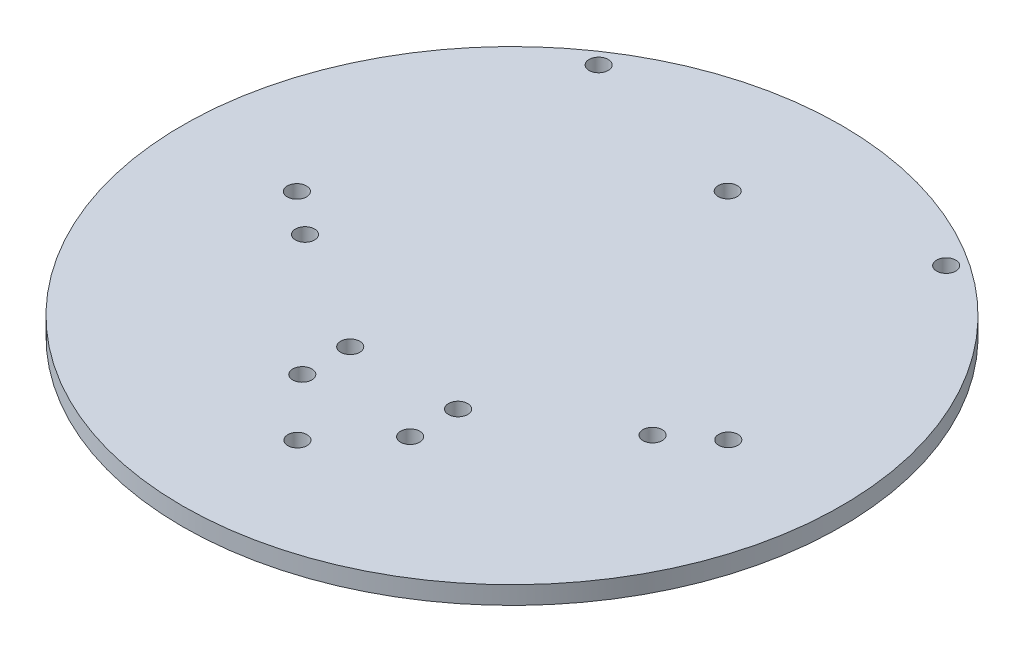
ISO-10303-21;
HEADER;
FILE_DESCRIPTION(('STEP AP214'),'2;1');
FILE_NAME('part.step','',(''),(''),'','','');
FILE_SCHEMA(('AUTOMOTIVE_DESIGN { 1 0 10303 214 1 1 1 1 }'));
ENDSEC;
DATA;
#1=APPLICATION_CONTEXT('core data for automotive mechanical design processes');
#2=APPLICATION_PROTOCOL_DEFINITION('international standard','automotive_design',2000,#1);
#3=PRODUCT_CONTEXT('',#1,'mechanical');
#4=PRODUCT('Part','Part','',(#3));
#5=PRODUCT_RELATED_PRODUCT_CATEGORY('part','',(#4));
#6=PRODUCT_DEFINITION_FORMATION('','',#4);
#7=PRODUCT_DEFINITION_CONTEXT('part definition',#1,'design');
#8=PRODUCT_DEFINITION('design','',#6,#7);
#9=PRODUCT_DEFINITION_SHAPE('','',#8);
#10=(LENGTH_UNIT() NAMED_UNIT(*) SI_UNIT(.MILLI.,.METRE.));
#11=(NAMED_UNIT(*) PLANE_ANGLE_UNIT() SI_UNIT($,.RADIAN.));
#12=(NAMED_UNIT(*) SI_UNIT($,.STERADIAN.) SOLID_ANGLE_UNIT());
#13=UNCERTAINTY_MEASURE_WITH_UNIT(LENGTH_MEASURE(1.E-05),#10,'distance_accuracy_value','');
#14=(GEOMETRIC_REPRESENTATION_CONTEXT(3) GLOBAL_UNCERTAINTY_ASSIGNED_CONTEXT((#13)) GLOBAL_UNIT_ASSIGNED_CONTEXT((#10,
#11,#12)) REPRESENTATION_CONTEXT('',''));
#15=CARTESIAN_POINT('',(0.,0.,0.));
#16=DIRECTION('',(0.,0.,1.));
#17=DIRECTION('',(1.,0.,0.));
#18=AXIS2_PLACEMENT_3D('',#15,#16,#17);
#19=CARTESIAN_POINT('',(9.,3.,26.));
#20=DIRECTION('',(0.,-1.,0.));
#21=DIRECTION('',(0.,0.,-1.));
#22=AXIS2_PLACEMENT_3D('',#19,#20,#21);
#23=CYLINDRICAL_SURFACE('',#22,1.6);
#24=CARTESIAN_POINT('',(9.,3.,26.));
#25=DIRECTION('',(0.,1.,0.));
#26=DIRECTION('',(0.,0.,1.));
#27=AXIS2_PLACEMENT_3D('',#24,#25,#26);
#28=CIRCLE('',#27,1.6);
#29=CARTESIAN_POINT('',(9.,3.,27.6));
#30=VERTEX_POINT('',#29);
#31=EDGE_CURVE('E49',#30,#30,#28,.T.);
#32=ORIENTED_EDGE('',*,*,#31,.T.);
#33=EDGE_LOOP('',(#32));
#34=FACE_BOUND('',#33,.T.);
#35=CARTESIAN_POINT('',(9.,0.,26.));
#36=DIRECTION('',(0.,1.,0.));
#37=DIRECTION('',(0.,0.,1.));
#38=AXIS2_PLACEMENT_3D('',#35,#36,#37);
#39=CIRCLE('',#38,1.6);
#40=CARTESIAN_POINT('',(9.,0.,27.6));
#41=VERTEX_POINT('',#40);
#42=EDGE_CURVE('E90',#41,#41,#39,.T.);
#43=ORIENTED_EDGE('',*,*,#42,.F.);
#44=EDGE_LOOP('',(#43));
#45=FACE_BOUND('',#44,.T.);
#46=ADVANCED_FACE('F41',(#34,#45),#23,.F.);
#47=CARTESIAN_POINT('',(-9.,3.,18.));
#48=DIRECTION('',(0.,-1.,0.));
#49=DIRECTION('',(0.,0.,-1.));
#50=AXIS2_PLACEMENT_3D('',#47,#48,#49);
#51=CYLINDRICAL_SURFACE('',#50,1.6);
#52=CARTESIAN_POINT('',(-9.,3.,18.));
#53=DIRECTION('',(0.,1.,0.));
#54=DIRECTION('',(0.,0.,1.));
#55=AXIS2_PLACEMENT_3D('',#52,#53,#54);
#56=CIRCLE('',#55,1.6);
#57=CARTESIAN_POINT('',(-9.,3.,19.6));
#58=VERTEX_POINT('',#57);
#59=EDGE_CURVE('E54',#58,#58,#56,.T.);
#60=ORIENTED_EDGE('',*,*,#59,.T.);
#61=EDGE_LOOP('',(#60));
#62=FACE_BOUND('',#61,.T.);
#63=CARTESIAN_POINT('',(-9.,0.,18.));
#64=DIRECTION('',(0.,1.,0.));
#65=DIRECTION('',(0.,0.,1.));
#66=AXIS2_PLACEMENT_3D('',#63,#64,#65);
#67=CIRCLE('',#66,1.6);
#68=CARTESIAN_POINT('',(-9.,0.,19.6));
#69=VERTEX_POINT('',#68);
#70=EDGE_CURVE('E88',#69,#69,#67,.T.);
#71=ORIENTED_EDGE('',*,*,#70,.F.);
#72=EDGE_LOOP('',(#71));
#73=FACE_BOUND('',#72,.T.);
#74=ADVANCED_FACE('F132',(#62,#73),#51,.F.);
#75=CARTESIAN_POINT('',(-29.,3.,5.54272467358266));
#76=DIRECTION('',(0.,-1.,0.));
#77=DIRECTION('',(0.,0.,-1.));
#78=AXIS2_PLACEMENT_3D('',#75,#76,#77);
#79=CYLINDRICAL_SURFACE('',#78,1.6);
#80=CARTESIAN_POINT('',(-29.,3.,5.54272467358266));
#81=DIRECTION('',(0.,1.,0.));
#82=DIRECTION('',(0.,0.,1.));
#83=AXIS2_PLACEMENT_3D('',#80,#81,#82);
#84=CIRCLE('',#83,1.6);
#85=CARTESIAN_POINT('',(-29.,3.,7.14272467358266));
#86=VERTEX_POINT('',#85);
#87=EDGE_CURVE('E127',#86,#86,#84,.F.);
#88=ORIENTED_EDGE('',*,*,#87,.F.);
#89=EDGE_LOOP('',(#88));
#90=FACE_BOUND('',#89,.T.);
#91=CARTESIAN_POINT('',(-29.,0.,5.54272467358266));
#92=DIRECTION('',(0.,1.,0.));
#93=DIRECTION('',(0.,0.,1.));
#94=AXIS2_PLACEMENT_3D('',#91,#92,#93);
#95=CIRCLE('',#94,1.6);
#96=CARTESIAN_POINT('',(-29.,0.,7.14272467358266));
#97=VERTEX_POINT('',#96);
#98=EDGE_CURVE('E85',#97,#97,#95,.F.);
#99=ORIENTED_EDGE('',*,*,#98,.T.);
#100=EDGE_LOOP('',(#99));
#101=FACE_BOUND('',#100,.T.);
#102=ADVANCED_FACE('F149',(#90,#101),#79,.F.);
#103=CARTESIAN_POINT('',(29.,3.,5.54272467358265));
#104=DIRECTION('',(0.,-1.,0.));
#105=DIRECTION('',(0.,0.,-1.));
#106=AXIS2_PLACEMENT_3D('',#103,#104,#105);
#107=CYLINDRICAL_SURFACE('',#106,1.6);
#108=CARTESIAN_POINT('',(29.,3.,5.54272467358265));
#109=DIRECTION('',(0.,1.,0.));
#110=DIRECTION('',(0.,0.,1.));
#111=AXIS2_PLACEMENT_3D('',#108,#109,#110);
#112=CIRCLE('',#111,1.6);
#113=CARTESIAN_POINT('',(29.,3.,7.14272467358266));
#114=VERTEX_POINT('',#113);
#115=EDGE_CURVE('E124',#114,#114,#112,.T.);
#116=ORIENTED_EDGE('',*,*,#115,.T.);
#117=EDGE_LOOP('',(#116));
#118=FACE_BOUND('',#117,.T.);
#119=CARTESIAN_POINT('',(29.,0.,5.54272467358265));
#120=DIRECTION('',(0.,1.,0.));
#121=DIRECTION('',(0.,0.,1.));
#122=AXIS2_PLACEMENT_3D('',#119,#120,#121);
#123=CIRCLE('',#122,1.6);
#124=CARTESIAN_POINT('',(29.,0.,7.14272467358266));
#125=VERTEX_POINT('',#124);
#126=EDGE_CURVE('E82',#125,#125,#123,.T.);
#127=ORIENTED_EDGE('',*,*,#126,.F.);
#128=EDGE_LOOP('',(#127));
#129=FACE_BOUND('',#128,.T.);
#130=ADVANCED_FACE('F156',(#118,#129),#107,.F.);
#131=CARTESIAN_POINT('',(29.0012957228663,3.,-43.4572753092857));
#132=DIRECTION('',(0.,-1.,0.));
#133=DIRECTION('',(0.,0.,-1.));
#134=AXIS2_PLACEMENT_3D('',#131,#132,#133);
#135=CYLINDRICAL_SURFACE('',#134,1.60000000000005);
#136=CARTESIAN_POINT('',(29.0012957228663,3.,-43.4572753092857));
#137=DIRECTION('',(0.,1.,0.));
#138=DIRECTION('',(0.,0.,1.));
#139=AXIS2_PLACEMENT_3D('',#136,#137,#138);
#140=CIRCLE('',#139,1.60000000000005);
#141=CARTESIAN_POINT('',(29.0012957228663,3.,-41.8572753092857));
#142=VERTEX_POINT('',#141);
#143=EDGE_CURVE('E121',#142,#142,#140,.T.);
#144=ORIENTED_EDGE('',*,*,#143,.T.);
#145=EDGE_LOOP('',(#144));
#146=FACE_BOUND('',#145,.T.);
#147=CARTESIAN_POINT('',(29.0012957228663,0.,-43.4572753092857));
#148=DIRECTION('',(0.,1.,0.));
#149=DIRECTION('',(0.,0.,1.));
#150=AXIS2_PLACEMENT_3D('',#147,#148,#149);
#151=CIRCLE('',#150,1.60000000000005);
#152=CARTESIAN_POINT('',(29.0012957228663,0.,-41.8572753092857));
#153=VERTEX_POINT('',#152);
#154=EDGE_CURVE('E79',#153,#153,#151,.T.);
#155=ORIENTED_EDGE('',*,*,#154,.F.);
#156=EDGE_LOOP('',(#155));
#157=FACE_BOUND('',#156,.T.);
#158=ADVANCED_FACE('F160',(#146,#157),#135,.F.);
#159=CARTESIAN_POINT('',(-28.9987042771337,3.,-43.4572753092857));
#160=DIRECTION('',(0.,-1.,0.));
#161=DIRECTION('',(0.,0.,-1.));
#162=AXIS2_PLACEMENT_3D('',#159,#160,#161);
#163=CYLINDRICAL_SURFACE('',#162,1.60000000000001);
#164=CARTESIAN_POINT('',(-28.9987042771337,3.,-43.4572753092857));
#165=DIRECTION('',(0.,1.,0.));
#166=DIRECTION('',(0.,0.,1.));
#167=AXIS2_PLACEMENT_3D('',#164,#165,#166);
#168=CIRCLE('',#167,1.60000000000001);
#169=CARTESIAN_POINT('',(-28.9987042771337,3.,-41.8572753092857));
#170=VERTEX_POINT('',#169);
#171=EDGE_CURVE('E118',#170,#170,#168,.T.);
#172=ORIENTED_EDGE('',*,*,#171,.T.);
#173=EDGE_LOOP('',(#172));
#174=FACE_BOUND('',#173,.T.);
#175=CARTESIAN_POINT('',(-28.9987042771337,0.,-43.4572753092857));
#176=DIRECTION('',(0.,1.,0.));
#177=DIRECTION('',(0.,0.,1.));
#178=AXIS2_PLACEMENT_3D('',#175,#176,#177);
#179=CIRCLE('',#178,1.60000000000001);
#180=CARTESIAN_POINT('',(-28.9987042771337,0.,-41.8572753092857));
#181=VERTEX_POINT('',#180);
#182=EDGE_CURVE('E76',#181,#181,#179,.T.);
#183=ORIENTED_EDGE('',*,*,#182,.F.);
#184=EDGE_LOOP('',(#183));
#185=FACE_BOUND('',#184,.T.);
#186=ADVANCED_FACE('F164',(#174,#185),#163,.F.);
#187=CARTESIAN_POINT('',(0.00129572286632482,3.,-35.999999976682));
#188=DIRECTION('',(0.,-1.,0.));
#189=DIRECTION('',(0.,0.,-1.));
#190=AXIS2_PLACEMENT_3D('',#187,#188,#189);
#191=CYLINDRICAL_SURFACE('',#190,1.59999999999989);
#192=CARTESIAN_POINT('',(0.00129572286632482,3.,-35.999999976682));
#193=DIRECTION('',(0.,1.,0.));
#194=DIRECTION('',(0.,0.,1.));
#195=AXIS2_PLACEMENT_3D('',#192,#193,#194);
#196=CIRCLE('',#195,1.59999999999989);
#197=CARTESIAN_POINT('',(0.00129572286632482,3.,-34.3999999766821));
#198=VERTEX_POINT('',#197);
#199=EDGE_CURVE('E115',#198,#198,#196,.T.);
#200=ORIENTED_EDGE('',*,*,#199,.T.);
#201=EDGE_LOOP('',(#200));
#202=FACE_BOUND('',#201,.T.);
#203=CARTESIAN_POINT('',(0.00129572286632482,0.,-35.999999976682));
#204=DIRECTION('',(0.,1.,0.));
#205=DIRECTION('',(0.,0.,1.));
#206=AXIS2_PLACEMENT_3D('',#203,#204,#205);
#207=CIRCLE('',#206,1.59999999999989);
#208=CARTESIAN_POINT('',(0.00129572286632482,0.,-34.3999999766821));
#209=VERTEX_POINT('',#208);
#210=EDGE_CURVE('E73',#209,#209,#207,.T.);
#211=ORIENTED_EDGE('',*,*,#210,.F.);
#212=EDGE_LOOP('',(#211));
#213=FACE_BOUND('',#212,.T.);
#214=ADVANCED_FACE('F168',(#202,#213),#191,.F.);
#215=CARTESIAN_POINT('',(-35.9023544312192,3.,-0.00142463433905774));
#216=DIRECTION('',(0.,-1.,0.));
#217=DIRECTION('',(0.,0.,-1.));
#218=AXIS2_PLACEMENT_3D('',#215,#216,#217);
#219=CYLINDRICAL_SURFACE('',#218,1.6);
#220=CARTESIAN_POINT('',(-35.9023544312192,3.,-0.00142463433905774));
#221=DIRECTION('',(0.,1.,0.));
#222=DIRECTION('',(0.,0.,1.));
#223=AXIS2_PLACEMENT_3D('',#220,#221,#222);
#224=CIRCLE('',#223,1.6);
#225=CARTESIAN_POINT('',(-35.9023544312192,3.,1.59857536566094));
#226=VERTEX_POINT('',#225);
#227=EDGE_CURVE('E112',#226,#226,#224,.T.);
#228=ORIENTED_EDGE('',*,*,#227,.T.);
#229=EDGE_LOOP('',(#228));
#230=FACE_BOUND('',#229,.T.);
#231=CARTESIAN_POINT('',(-35.9023544312192,0.,-0.00142463433905774));
#232=DIRECTION('',(0.,1.,0.));
#233=DIRECTION('',(0.,0.,1.));
#234=AXIS2_PLACEMENT_3D('',#231,#232,#233);
#235=CIRCLE('',#234,1.6);
#236=CARTESIAN_POINT('',(-35.9023544312192,0.,1.59857536566094));
#237=VERTEX_POINT('',#236);
#238=EDGE_CURVE('E70',#237,#237,#235,.T.);
#239=ORIENTED_EDGE('',*,*,#238,.F.);
#240=EDGE_LOOP('',(#239));
#241=FACE_BOUND('',#240,.T.);
#242=ADVANCED_FACE('F172',(#230,#241),#219,.F.);
#243=CARTESIAN_POINT('',(0.0962209111236621,3.,35.9022255197465));
#244=DIRECTION('',(0.,-1.,0.));
#245=DIRECTION('',(0.,0.,-1.));
#246=AXIS2_PLACEMENT_3D('',#243,#244,#245);
#247=CYLINDRICAL_SURFACE('',#246,1.59999999999999);
#248=CARTESIAN_POINT('',(0.0962209111236621,3.,35.9022255197465));
#249=DIRECTION('',(0.,1.,0.));
#250=DIRECTION('',(0.,0.,1.));
#251=AXIS2_PLACEMENT_3D('',#248,#249,#250);
#252=CIRCLE('',#251,1.59999999999999);
#253=CARTESIAN_POINT('',(0.0962209111236621,3.,37.5022255197465));
#254=VERTEX_POINT('',#253);
#255=EDGE_CURVE('E109',#254,#254,#252,.T.);
#256=ORIENTED_EDGE('',*,*,#255,.T.);
#257=EDGE_LOOP('',(#256));
#258=FACE_BOUND('',#257,.T.);
#259=CARTESIAN_POINT('',(0.0962209111236621,0.,35.9022255197465));
#260=DIRECTION('',(0.,1.,0.));
#261=DIRECTION('',(0.,0.,1.));
#262=AXIS2_PLACEMENT_3D('',#259,#260,#261);
#263=CIRCLE('',#262,1.59999999999999);
#264=CARTESIAN_POINT('',(0.0962209111236621,0.,37.5022255197465));
#265=VERTEX_POINT('',#264);
#266=EDGE_CURVE('E67',#265,#265,#263,.T.);
#267=ORIENTED_EDGE('',*,*,#266,.F.);
#268=EDGE_LOOP('',(#267));
#269=FACE_BOUND('',#268,.T.);
#270=ADVANCED_FACE('F176',(#258,#269),#247,.F.);
#271=CARTESIAN_POINT('',(35.9998710652092,3.,-0.0963498225964156));
#272=DIRECTION('',(0.,-1.,0.));
#273=DIRECTION('',(0.,0.,-1.));
#274=AXIS2_PLACEMENT_3D('',#271,#272,#273);
#275=CYLINDRICAL_SURFACE('',#274,1.6);
#276=CARTESIAN_POINT('',(35.9998710652092,3.,-0.0963498225964156));
#277=DIRECTION('',(0.,1.,0.));
#278=DIRECTION('',(0.,0.,1.));
#279=AXIS2_PLACEMENT_3D('',#276,#277,#278);
#280=CIRCLE('',#279,1.6);
#281=CARTESIAN_POINT('',(35.9998710652092,3.,1.50365017740358));
#282=VERTEX_POINT('',#281);
#283=EDGE_CURVE('E104',#282,#282,#280,.T.);
#284=ORIENTED_EDGE('',*,*,#283,.T.);
#285=EDGE_LOOP('',(#284));
#286=FACE_BOUND('',#285,.T.);
#287=CARTESIAN_POINT('',(35.9998710652092,0.,-0.0963498225964156));
#288=DIRECTION('',(0.,1.,0.));
#289=DIRECTION('',(0.,0.,1.));
#290=AXIS2_PLACEMENT_3D('',#287,#288,#289);
#291=CIRCLE('',#290,1.6);
#292=CARTESIAN_POINT('',(35.9998710652092,0.,1.50365017740358));
#293=VERTEX_POINT('',#292);
#294=EDGE_CURVE('E64',#293,#293,#291,.T.);
#295=ORIENTED_EDGE('',*,*,#294,.F.);
#296=EDGE_LOOP('',(#295));
#297=FACE_BOUND('',#296,.T.);
#298=ADVANCED_FACE('F180',(#286,#297),#275,.F.);
#299=CARTESIAN_POINT('',(0.,3.,0.));
#300=DIRECTION('',(0.,-1.,0.));
#301=DIRECTION('',(0.,0.,-1.));
#302=AXIS2_PLACEMENT_3D('',#299,#300,#301);
#303=CYLINDRICAL_SURFACE('',#302,55.);
#304=CARTESIAN_POINT('',(0.,3.,0.));
#305=DIRECTION('',(0.,1.,0.));
#306=DIRECTION('',(0.,0.,1.));
#307=AXIS2_PLACEMENT_3D('',#304,#305,#306);
#308=CIRCLE('',#307,55.);
#309=CARTESIAN_POINT('',(0.,3.,55.));
#310=VERTEX_POINT('',#309);
#311=EDGE_CURVE('E99',#310,#310,#308,.T.);
#312=ORIENTED_EDGE('',*,*,#311,.F.);
#313=EDGE_LOOP('',(#312));
#314=FACE_BOUND('',#313,.T.);
#315=CARTESIAN_POINT('',(0.,0.,0.));
#316=DIRECTION('',(0.,1.,0.));
#317=DIRECTION('',(0.,0.,1.));
#318=AXIS2_PLACEMENT_3D('',#315,#316,#317);
#319=CIRCLE('',#318,55.);
#320=CARTESIAN_POINT('',(0.,0.,55.));
#321=VERTEX_POINT('',#320);
#322=EDGE_CURVE('E61',#321,#321,#319,.T.);
#323=ORIENTED_EDGE('',*,*,#322,.T.);
#324=EDGE_LOOP('',(#323));
#325=FACE_BOUND('',#324,.T.);
#326=ADVANCED_FACE('F183',(#314,#325),#303,.T.);
#327=CARTESIAN_POINT('',(-9.,3.,26.));
#328=DIRECTION('',(0.,-1.,0.));
#329=DIRECTION('',(0.,0.,-1.));
#330=AXIS2_PLACEMENT_3D('',#327,#328,#329);
#331=CYLINDRICAL_SURFACE('',#330,1.6);
#332=CARTESIAN_POINT('',(-9.,3.,26.));
#333=DIRECTION('',(0.,1.,0.));
#334=DIRECTION('',(0.,0.,1.));
#335=AXIS2_PLACEMENT_3D('',#332,#333,#334);
#336=CIRCLE('',#335,1.6);
#337=CARTESIAN_POINT('',(-9.,3.,27.6));
#338=VERTEX_POINT('',#337);
#339=EDGE_CURVE('E95',#338,#338,#336,.F.);
#340=ORIENTED_EDGE('',*,*,#339,.F.);
#341=EDGE_LOOP('',(#340));
#342=FACE_BOUND('',#341,.T.);
#343=CARTESIAN_POINT('',(-9.,0.,26.));
#344=DIRECTION('',(0.,1.,0.));
#345=DIRECTION('',(0.,0.,1.));
#346=AXIS2_PLACEMENT_3D('',#343,#344,#345);
#347=CIRCLE('',#346,1.6);
#348=CARTESIAN_POINT('',(-9.,0.,27.6));
#349=VERTEX_POINT('',#348);
#350=EDGE_CURVE('E58',#349,#349,#347,.F.);
#351=ORIENTED_EDGE('',*,*,#350,.T.);
#352=EDGE_LOOP('',(#351));
#353=FACE_BOUND('',#352,.T.);
#354=ADVANCED_FACE('F43',(#342,#353),#331,.F.);
#355=CARTESIAN_POINT('',(9.,3.,18.));
#356=DIRECTION('',(0.,-1.,0.));
#357=DIRECTION('',(0.,0.,-1.));
#358=AXIS2_PLACEMENT_3D('',#355,#356,#357);
#359=CYLINDRICAL_SURFACE('',#358,1.6);
#360=CARTESIAN_POINT('',(9.,3.,18.));
#361=DIRECTION('',(0.,1.,0.));
#362=DIRECTION('',(0.,0.,1.));
#363=AXIS2_PLACEMENT_3D('',#360,#361,#362);
#364=CIRCLE('',#363,1.6);
#365=CARTESIAN_POINT('',(9.,3.,19.6));
#366=VERTEX_POINT('',#365);
#367=EDGE_CURVE('E10',#366,#366,#364,.F.);
#368=ORIENTED_EDGE('',*,*,#367,.F.);
#369=EDGE_LOOP('',(#368));
#370=FACE_BOUND('',#369,.T.);
#371=CARTESIAN_POINT('',(9.,0.,18.));
#372=DIRECTION('',(0.,1.,0.));
#373=DIRECTION('',(0.,0.,1.));
#374=AXIS2_PLACEMENT_3D('',#371,#372,#373);
#375=CIRCLE('',#374,1.6);
#376=CARTESIAN_POINT('',(9.,0.,19.6));
#377=VERTEX_POINT('',#376);
#378=EDGE_CURVE('E45',#377,#377,#375,.F.);
#379=ORIENTED_EDGE('',*,*,#378,.T.);
#380=EDGE_LOOP('',(#379));
#381=FACE_BOUND('',#380,.T.);
#382=ADVANCED_FACE('F139',(#370,#381),#359,.F.);
#383=CARTESIAN_POINT('',(0.,3.,0.));
#384=DIRECTION('',(0.,1.,0.));
#385=DIRECTION('',(0.,0.,1.));
#386=AXIS2_PLACEMENT_3D('',#383,#384,#385);
#387=PLANE('',#386);
#388=ORIENTED_EDGE('',*,*,#339,.T.);
#389=EDGE_LOOP('',(#388));
#390=FACE_BOUND('',#389,.T.);
#391=ORIENTED_EDGE('',*,*,#311,.T.);
#392=EDGE_LOOP('',(#391));
#393=FACE_BOUND('',#392,.T.);
#394=ORIENTED_EDGE('',*,*,#283,.F.);
#395=EDGE_LOOP('',(#394));
#396=FACE_BOUND('',#395,.T.);
#397=ORIENTED_EDGE('',*,*,#255,.F.);
#398=EDGE_LOOP('',(#397));
#399=FACE_BOUND('',#398,.T.);
#400=ORIENTED_EDGE('',*,*,#227,.F.);
#401=EDGE_LOOP('',(#400));
#402=FACE_BOUND('',#401,.T.);
#403=ORIENTED_EDGE('',*,*,#199,.F.);
#404=EDGE_LOOP('',(#403));
#405=FACE_BOUND('',#404,.T.);
#406=ORIENTED_EDGE('',*,*,#171,.F.);
#407=EDGE_LOOP('',(#406));
#408=FACE_BOUND('',#407,.T.);
#409=ORIENTED_EDGE('',*,*,#143,.F.);
#410=EDGE_LOOP('',(#409));
#411=FACE_BOUND('',#410,.T.);
#412=ORIENTED_EDGE('',*,*,#115,.F.);
#413=EDGE_LOOP('',(#412));
#414=FACE_BOUND('',#413,.T.);
#415=ORIENTED_EDGE('',*,*,#87,.T.);
#416=EDGE_LOOP('',(#415));
#417=FACE_BOUND('',#416,.T.);
#418=ORIENTED_EDGE('',*,*,#59,.F.);
#419=EDGE_LOOP('',(#418));
#420=FACE_BOUND('',#419,.T.);
#421=ORIENTED_EDGE('',*,*,#31,.F.);
#422=EDGE_LOOP('',(#421));
#423=FACE_BOUND('',#422,.T.);
#424=ORIENTED_EDGE('',*,*,#367,.T.);
#425=EDGE_LOOP('',(#424));
#426=FACE_BOUND('',#425,.T.);
#427=ADVANCED_FACE('F135',(#390,#393,#396,#399,#402,#405,#408,#411,#414,#417,#420,#423,#426),
#387,.T.);
#428=CARTESIAN_POINT('',(0.,0.,0.));
#429=DIRECTION('',(0.,1.,0.));
#430=DIRECTION('',(0.,0.,1.));
#431=AXIS2_PLACEMENT_3D('',#428,#429,#430);
#432=PLANE('',#431);
#433=ORIENTED_EDGE('',*,*,#350,.F.);
#434=EDGE_LOOP('',(#433));
#435=FACE_BOUND('',#434,.T.);
#436=ORIENTED_EDGE('',*,*,#322,.F.);
#437=EDGE_LOOP('',(#436));
#438=FACE_BOUND('',#437,.T.);
#439=ORIENTED_EDGE('',*,*,#294,.T.);
#440=EDGE_LOOP('',(#439));
#441=FACE_BOUND('',#440,.T.);
#442=ORIENTED_EDGE('',*,*,#266,.T.);
#443=EDGE_LOOP('',(#442));
#444=FACE_BOUND('',#443,.T.);
#445=ORIENTED_EDGE('',*,*,#238,.T.);
#446=EDGE_LOOP('',(#445));
#447=FACE_BOUND('',#446,.T.);
#448=ORIENTED_EDGE('',*,*,#210,.T.);
#449=EDGE_LOOP('',(#448));
#450=FACE_BOUND('',#449,.T.);
#451=ORIENTED_EDGE('',*,*,#182,.T.);
#452=EDGE_LOOP('',(#451));
#453=FACE_BOUND('',#452,.T.);
#454=ORIENTED_EDGE('',*,*,#154,.T.);
#455=EDGE_LOOP('',(#454));
#456=FACE_BOUND('',#455,.T.);
#457=ORIENTED_EDGE('',*,*,#126,.T.);
#458=EDGE_LOOP('',(#457));
#459=FACE_BOUND('',#458,.T.);
#460=ORIENTED_EDGE('',*,*,#98,.F.);
#461=EDGE_LOOP('',(#460));
#462=FACE_BOUND('',#461,.T.);
#463=ORIENTED_EDGE('',*,*,#70,.T.);
#464=EDGE_LOOP('',(#463));
#465=FACE_BOUND('',#464,.T.);
#466=ORIENTED_EDGE('',*,*,#42,.T.);
#467=EDGE_LOOP('',(#466));
#468=FACE_BOUND('',#467,.T.);
#469=ORIENTED_EDGE('',*,*,#378,.F.);
#470=EDGE_LOOP('',(#469));
#471=FACE_BOUND('',#470,.T.);
#472=ADVANCED_FACE('F138',(#435,#438,#441,#444,#447,#450,#453,#456,#459,#462,#465,#468,#471),
#432,.F.);
#473=CLOSED_SHELL('',(#46,#74,#102,#130,#158,#186,#214,#242,#270,#298,#326,#354,#382,#427,#472));
#474=MANIFOLD_SOLID_BREP('B2',#473);
#475=ADVANCED_BREP_SHAPE_REPRESENTATION('',(#18,#474),#14);
#476=SHAPE_DEFINITION_REPRESENTATION(#9,#475);
ENDSEC;
END-ISO-10303-21;
